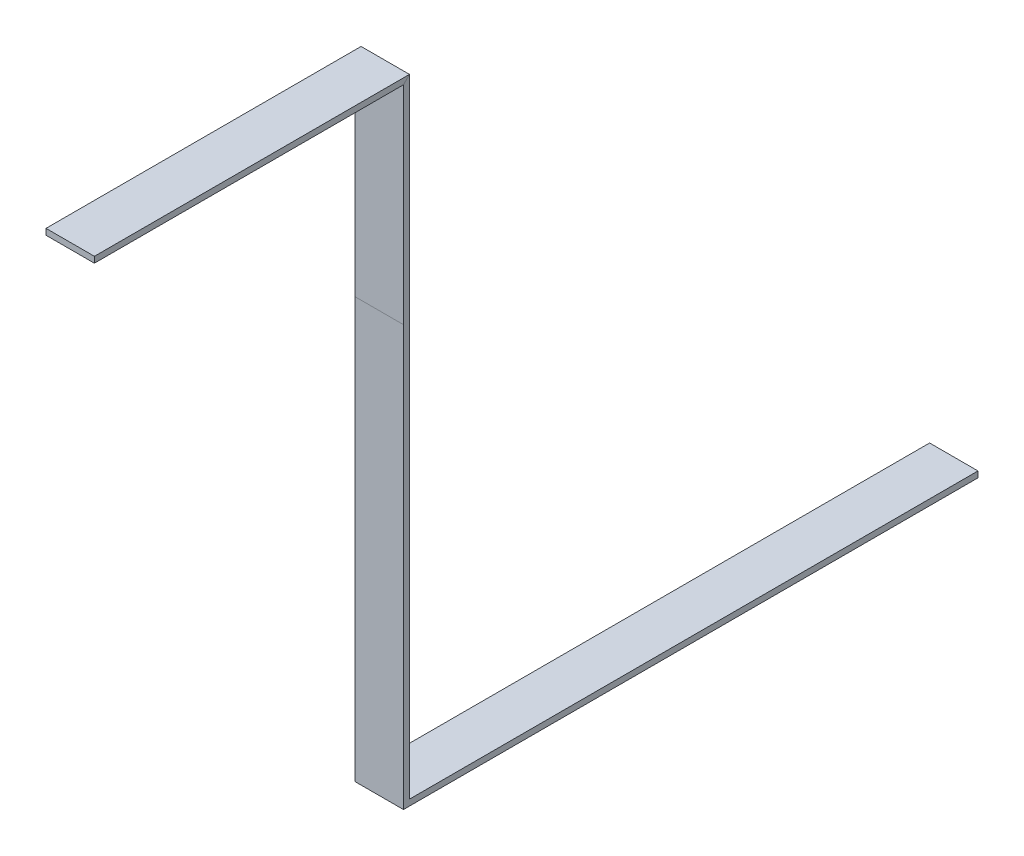
ISO-10303-21;
HEADER;
FILE_DESCRIPTION(('STEP AP214'),'2;1');
FILE_NAME('part.step','',(''),(''),'','','');
FILE_SCHEMA(('AUTOMOTIVE_DESIGN { 1 0 10303 214 1 1 1 1 }'));
ENDSEC;
DATA;
#1=APPLICATION_CONTEXT('core data for automotive mechanical design processes');
#2=APPLICATION_PROTOCOL_DEFINITION('international standard','automotive_design',2000,#1);
#3=PRODUCT_CONTEXT('',#1,'mechanical');
#4=PRODUCT('Part','Part','',(#3));
#5=PRODUCT_RELATED_PRODUCT_CATEGORY('part','',(#4));
#6=PRODUCT_DEFINITION_FORMATION('','',#4);
#7=PRODUCT_DEFINITION_CONTEXT('part definition',#1,'design');
#8=PRODUCT_DEFINITION('design','',#6,#7);
#9=PRODUCT_DEFINITION_SHAPE('','',#8);
#10=(LENGTH_UNIT() NAMED_UNIT(*) SI_UNIT(.MILLI.,.METRE.));
#11=(NAMED_UNIT(*) PLANE_ANGLE_UNIT() SI_UNIT($,.RADIAN.));
#12=(NAMED_UNIT(*) SI_UNIT($,.STERADIAN.) SOLID_ANGLE_UNIT());
#13=UNCERTAINTY_MEASURE_WITH_UNIT(LENGTH_MEASURE(1.E-05),#10,'distance_accuracy_value','');
#14=(GEOMETRIC_REPRESENTATION_CONTEXT(3) GLOBAL_UNCERTAINTY_ASSIGNED_CONTEXT((#13)) GLOBAL_UNIT_ASSIGNED_CONTEXT((#10,
#11,#12)) REPRESENTATION_CONTEXT('',''));
#15=CARTESIAN_POINT('',(0.,0.,0.));
#16=DIRECTION('',(0.,0.,1.));
#17=DIRECTION('',(1.,0.,0.));
#18=AXIS2_PLACEMENT_3D('',#15,#16,#17);
#19=CARTESIAN_POINT('',(-96.5999999999999,-272.07792076474,612.092449283312));
#20=DIRECTION('',(0.,-1.,0.));
#21=DIRECTION('',(0.,0.,-1.));
#22=AXIS2_PLACEMENT_3D('',#19,#20,#21);
#23=PLANE('',#22);
#24=DIRECTION('',(-1.,0.,0.));
#25=VECTOR('',#24,1.);
#26=CARTESIAN_POINT('',(-96.5999999999999,-272.07792076474,0.00397627219106411));
#27=LINE('',#26,#25);
#28=CARTESIAN_POINT('',(25.4,-272.07792076474,0.0039762721910086));
#29=VERTEX_POINT('',#28);
#30=CARTESIAN_POINT('',(-25.4,-272.07792076474,0.00397627219106411));
#31=VERTEX_POINT('',#30);
#32=EDGE_CURVE('E11',#29,#31,#27,.T.);
#33=ORIENTED_EDGE('',*,*,#32,.F.);
#34=DIRECTION('',(0.,0.,-1.));
#35=VECTOR('',#34,1.);
#36=CARTESIAN_POINT('',(25.4,-272.07792076474,612.092449283312));
#37=LINE('',#36,#35);
#38=CARTESIAN_POINT('',(25.4,-272.07792076474,0.));
#39=VERTEX_POINT('',#38);
#40=EDGE_CURVE('E160',#29,#39,#37,.T.);
#41=ORIENTED_EDGE('',*,*,#40,.T.);
#42=DIRECTION('',(1.,0.,0.));
#43=VECTOR('',#42,1.);
#44=CARTESIAN_POINT('',(0.,-272.07792076474,0.));
#45=LINE('',#44,#43);
#46=CARTESIAN_POINT('',(-25.4,-272.07792076474,0.));
#47=VERTEX_POINT('',#46);
#48=EDGE_CURVE('E276',#47,#39,#45,.T.);
#49=ORIENTED_EDGE('',*,*,#48,.F.);
#50=DIRECTION('',(0.,0.,-1.));
#51=VECTOR('',#50,1.);
#52=CARTESIAN_POINT('',(-25.4,-272.07792076474,574.));
#53=LINE('',#52,#51);
#54=EDGE_CURVE('E272',#31,#47,#53,.T.);
#55=ORIENTED_EDGE('',*,*,#54,.F.);
#56=EDGE_LOOP('',(#33,#41,#49,#55));
#57=FACE_BOUND('',#56,.T.);
#58=ADVANCED_FACE('F36',(#57),#23,.F.);
#59=CARTESIAN_POINT('',(25.4,3.155,574.));
#60=DIRECTION('',(-1.,0.,0.));
#61=DIRECTION('',(0.,0.,1.));
#62=AXIS2_PLACEMENT_3D('',#59,#60,#61);
#63=PLANE('',#62);
#64=DIRECTION('',(0.,1.,0.));
#65=VECTOR('',#64,1.);
#66=CARTESIAN_POINT('',(25.4,-278.803420764741,6.3139762721911));
#67=LINE('',#66,#65);
#68=CARTESIAN_POINT('',(25.4,-272.078734833776,6.31088055029496));
#69=VERTEX_POINT('',#68);
#70=CARTESIAN_POINT('',(25.4,-54.0479207647403,6.31397627219113));
#71=VERTEX_POINT('',#70);
#72=EDGE_CURVE('E174',#69,#71,#67,.T.);
#73=ORIENTED_EDGE('',*,*,#72,.F.);
#74=DIRECTION('',(0.,1.,0.));
#75=VECTOR('',#74,1.);
#76=CARTESIAN_POINT('',(25.4,-712.845,6.31000000000004));
#77=LINE('',#76,#75);
#78=CARTESIAN_POINT('',(25.4,-712.845,6.31000000000004));
#79=VERTEX_POINT('',#78);
#80=EDGE_CURVE('E40',#79,#69,#77,.T.);
#81=ORIENTED_EDGE('',*,*,#80,.F.);
#82=DIRECTION('',(0.,0.,-1.));
#83=VECTOR('',#82,1.);
#84=CARTESIAN_POINT('',(25.4,-712.845,0.));
#85=LINE('',#84,#83);
#86=CARTESIAN_POINT('',(25.4,-712.845,-596.7));
#87=VERTEX_POINT('',#86);
#88=EDGE_CURVE('E131',#79,#87,#85,.T.);
#89=ORIENTED_EDGE('',*,*,#88,.T.);
#90=DIRECTION('',(0.,1.,0.));
#91=VECTOR('',#90,1.);
#92=CARTESIAN_POINT('',(25.4,-706.535,-596.7));
#93=LINE('',#92,#91);
#94=CARTESIAN_POINT('',(25.4,-706.535,-596.7));
#95=VERTEX_POINT('',#94);
#96=EDGE_CURVE('E141',#87,#95,#93,.T.);
#97=ORIENTED_EDGE('',*,*,#96,.T.);
#98=DIRECTION('',(0.,0.,1.));
#99=VECTOR('',#98,1.);
#100=CARTESIAN_POINT('',(25.4,-706.535,-596.7));
#101=LINE('',#100,#99);
#102=CARTESIAN_POINT('',(25.4,-706.535,0.));
#103=VERTEX_POINT('',#102);
#104=EDGE_CURVE('E151',#95,#103,#101,.T.);
#105=ORIENTED_EDGE('',*,*,#104,.T.);
#106=DIRECTION('',(0.,1.,0.));
#107=VECTOR('',#106,1.);
#108=CARTESIAN_POINT('',(25.4,3.155,0.));
#109=LINE('',#108,#107);
#110=EDGE_CURVE('E54',#103,#39,#109,.T.);
#111=ORIENTED_EDGE('',*,*,#110,.T.);
#112=ORIENTED_EDGE('',*,*,#40,.F.);
#113=DIRECTION('',(0.,1.,0.));
#114=VECTOR('',#113,1.);
#115=CARTESIAN_POINT('',(25.4,-278.803420764741,0.0039762721910086));
#116=LINE('',#115,#114);
#117=CARTESIAN_POINT('',(25.4,-47.7379207647403,0.00397627219104076));
#118=VERTEX_POINT('',#117);
#119=EDGE_CURVE('E172',#29,#118,#116,.T.);
#120=ORIENTED_EDGE('',*,*,#119,.T.);
#121=DIRECTION('',(0.,0.707106781186548,-0.707106781186548));
#122=VECTOR('',#121,1.);
#123=CARTESIAN_POINT('',(25.4,-163.27067076474,115.536726272191));
#124=LINE('',#123,#122);
#125=EDGE_CURVE('E167',#71,#118,#124,.T.);
#126=ORIENTED_EDGE('',*,*,#125,.F.);
#127=EDGE_LOOP('',(#73,#81,#89,#97,#105,#111,#112,#120,#126));
#128=FACE_BOUND('',#127,.T.);
#129=ADVANCED_FACE('F38',(#128),#63,.F.);
#130=CARTESIAN_POINT('',(-25.4,3.155,574.));
#131=DIRECTION('',(1.,0.,0.));
#132=DIRECTION('',(0.,0.,-1.));
#133=AXIS2_PLACEMENT_3D('',#130,#131,#132);
#134=PLANE('',#133);
#135=DIRECTION('',(0.,-1.,0.));
#136=VECTOR('',#135,1.);
#137=CARTESIAN_POINT('',(-25.4,3.155,0.));
#138=LINE('',#137,#136);
#139=CARTESIAN_POINT('',(-25.4,-706.535,0.));
#140=VERTEX_POINT('',#139);
#141=EDGE_CURVE('E270',#47,#140,#138,.T.);
#142=ORIENTED_EDGE('',*,*,#141,.T.);
#143=DIRECTION('',(0.,0.,1.));
#144=VECTOR('',#143,1.);
#145=CARTESIAN_POINT('',(-25.4,-706.535,-596.7));
#146=LINE('',#145,#144);
#147=CARTESIAN_POINT('',(-25.4,-706.535,-596.7));
#148=VERTEX_POINT('',#147);
#149=EDGE_CURVE('E145',#148,#140,#146,.T.);
#150=ORIENTED_EDGE('',*,*,#149,.F.);
#151=DIRECTION('',(0.,-1.,0.));
#152=VECTOR('',#151,1.);
#153=CARTESIAN_POINT('',(-25.4,-706.535,-596.7));
#154=LINE('',#153,#152);
#155=CARTESIAN_POINT('',(-25.4,-712.845,-596.7));
#156=VERTEX_POINT('',#155);
#157=EDGE_CURVE('E138',#148,#156,#154,.T.);
#158=ORIENTED_EDGE('',*,*,#157,.T.);
#159=DIRECTION('',(0.,0.,1.));
#160=VECTOR('',#159,1.);
#161=CARTESIAN_POINT('',(-25.4,-712.845,0.));
#162=LINE('',#161,#160);
#163=CARTESIAN_POINT('',(-25.4,-712.845,6.31000000000004));
#164=VERTEX_POINT('',#163);
#165=EDGE_CURVE('E122',#156,#164,#162,.T.);
#166=ORIENTED_EDGE('',*,*,#165,.T.);
#167=DIRECTION('',(0.,1.,0.));
#168=VECTOR('',#167,1.);
#169=CARTESIAN_POINT('',(-25.4,-712.845,6.31000000000004));
#170=LINE('',#169,#168);
#171=CARTESIAN_POINT('',(-25.4,-272.078734833776,6.31088055029493));
#172=VERTEX_POINT('',#171);
#173=EDGE_CURVE('E258',#164,#172,#170,.T.);
#174=ORIENTED_EDGE('',*,*,#173,.T.);
#175=DIRECTION('',(0.,1.,0.));
#176=VECTOR('',#175,1.);
#177=CARTESIAN_POINT('',(-25.4,-278.803420764741,6.31397627219099));
#178=LINE('',#177,#176);
#179=CARTESIAN_POINT('',(-25.4,-54.0479207647402,6.31397627219104));
#180=VERTEX_POINT('',#179);
#181=EDGE_CURVE('E170',#172,#180,#178,.T.);
#182=ORIENTED_EDGE('',*,*,#181,.T.);
#183=DIRECTION('',(0.,-0.707106781186548,0.707106781186548));
#184=VECTOR('',#183,1.);
#185=CARTESIAN_POINT('',(-25.4,-163.27067076474,115.536726272191));
#186=LINE('',#185,#184);
#187=CARTESIAN_POINT('',(-25.4,-47.7379207647403,0.00397627219104109));
#188=VERTEX_POINT('',#187);
#189=EDGE_CURVE('E161',#188,#180,#186,.T.);
#190=ORIENTED_EDGE('',*,*,#189,.F.);
#191=DIRECTION('',(0.,1.,0.));
#192=VECTOR('',#191,1.);
#193=CARTESIAN_POINT('',(-25.4,-278.803420764741,0.0039762721910086));
#194=LINE('',#193,#192);
#195=EDGE_CURVE('E168',#31,#188,#194,.T.);
#196=ORIENTED_EDGE('',*,*,#195,.F.);
#197=ORIENTED_EDGE('',*,*,#54,.T.);
#198=EDGE_LOOP('',(#142,#150,#158,#166,#174,#182,#190,#196,#197));
#199=FACE_BOUND('',#198,.T.);
#200=ADVANCED_FACE('F143',(#199),#134,.F.);
#201=CARTESIAN_POINT('',(0.,0.,0.));
#202=DIRECTION('',(0.,0.,1.));
#203=DIRECTION('',(1.,0.,0.));
#204=AXIS2_PLACEMENT_3D('',#201,#202,#203);
#205=PLANE('',#204);
#206=ORIENTED_EDGE('',*,*,#110,.F.);
#207=DIRECTION('',(-1.,0.,0.));
#208=VECTOR('',#207,1.);
#209=CARTESIAN_POINT('',(0.,-706.535,0.));
#210=LINE('',#209,#208);
#211=EDGE_CURVE('E58',#103,#140,#210,.T.);
#212=ORIENTED_EDGE('',*,*,#211,.T.);
#213=ORIENTED_EDGE('',*,*,#141,.F.);
#214=ORIENTED_EDGE('',*,*,#48,.T.);
#215=EDGE_LOOP('',(#206,#212,#213,#214));
#216=FACE_BOUND('',#215,.T.);
#217=ADVANCED_FACE('F252',(#216),#205,.F.);
#218=CARTESIAN_POINT('',(-25.4,-712.845,6.31000000000004));
#219=DIRECTION('',(0.,0.,1.));
#220=DIRECTION('',(1.,0.,0.));
#221=AXIS2_PLACEMENT_3D('',#218,#219,#220);
#222=PLANE('',#221);
#223=CARTESIAN_POINT('',(-25.4,-272.07792076474,6.31397627219099));
#224=DIRECTION('',(1.,0.,0.));
#225=VECTOR('',#224,1.);
#226=LINE('',#223,#225);
#227=EDGE_CURVE('E46',#172,#69,#226,.T.);
#228=ORIENTED_EDGE('',*,*,#227,.F.);
#229=ORIENTED_EDGE('',*,*,#173,.F.);
#230=DIRECTION('',(1.,0.,0.));
#231=VECTOR('',#230,1.);
#232=CARTESIAN_POINT('',(-25.4,-712.845,6.31000000000004));
#233=LINE('',#232,#231);
#234=EDGE_CURVE('E128',#164,#79,#233,.T.);
#235=ORIENTED_EDGE('',*,*,#234,.T.);
#236=ORIENTED_EDGE('',*,*,#80,.T.);
#237=EDGE_LOOP('',(#228,#229,#235,#236));
#238=FACE_BOUND('',#237,.T.);
#239=ADVANCED_FACE('F248',(#238),#222,.T.);
#240=CARTESIAN_POINT('',(0.,-712.845,0.));
#241=DIRECTION('',(0.,1.,0.));
#242=DIRECTION('',(0.,0.,1.));
#243=AXIS2_PLACEMENT_3D('',#240,#241,#242);
#244=PLANE('',#243);
#245=ORIENTED_EDGE('',*,*,#88,.F.);
#246=ORIENTED_EDGE('',*,*,#234,.F.);
#247=ORIENTED_EDGE('',*,*,#165,.F.);
#248=DIRECTION('',(1.,0.,0.));
#249=VECTOR('',#248,1.);
#250=CARTESIAN_POINT('',(25.4,-712.845,-596.7));
#251=LINE('',#250,#249);
#252=EDGE_CURVE('E126',#156,#87,#251,.T.);
#253=ORIENTED_EDGE('',*,*,#252,.T.);
#254=EDGE_LOOP('',(#245,#246,#247,#253));
#255=FACE_BOUND('',#254,.T.);
#256=ADVANCED_FACE('F125',(#255),#244,.F.);
#257=CARTESIAN_POINT('',(-25.4,-278.803420764741,0.0039762721910086));
#258=DIRECTION('',(0.,0.,1.));
#259=DIRECTION('',(1.,0.,0.));
#260=AXIS2_PLACEMENT_3D('',#257,#258,#259);
#261=PLANE('',#260);
#262=ORIENTED_EDGE('',*,*,#119,.F.);
#263=ORIENTED_EDGE('',*,*,#32,.T.);
#264=ORIENTED_EDGE('',*,*,#195,.T.);
#265=DIRECTION('',(-1.,0.,0.));
#266=VECTOR('',#265,1.);
#267=CARTESIAN_POINT('',(-25.4,-47.7379207647402,0.0039762721910086));
#268=LINE('',#267,#266);
#269=EDGE_CURVE('E164',#118,#188,#268,.T.);
#270=ORIENTED_EDGE('',*,*,#269,.F.);
#271=EDGE_LOOP('',(#262,#263,#264,#270));
#272=FACE_BOUND('',#271,.T.);
#273=ADVANCED_FACE('F219',(#272),#261,.F.);
#274=CARTESIAN_POINT('',(0.,-326.125841529481,330.698976272191));
#275=DIRECTION('',(0.,0.,1.));
#276=DIRECTION('',(-1.,0.,0.));
#277=AXIS2_PLACEMENT_3D('',#274,#275,#276);
#278=PLANE('',#277);
#279=DIRECTION('',(0.,-1.,0.));
#280=VECTOR('',#279,1.);
#281=CARTESIAN_POINT('',(25.4,-47.7379207647403,330.698976272191));
#282=LINE('',#281,#280);
#283=CARTESIAN_POINT('',(25.4,-47.7379207647403,330.698976272191));
#284=VERTEX_POINT('',#283);
#285=CARTESIAN_POINT('',(25.4,-54.0479207647404,330.698976272191));
#286=VERTEX_POINT('',#285);
#287=EDGE_CURVE('E182',#284,#286,#282,.T.);
#288=ORIENTED_EDGE('',*,*,#287,.F.);
#289=DIRECTION('',(1.,0.,0.));
#290=VECTOR('',#289,1.);
#291=CARTESIAN_POINT('',(-25.4,-47.7379207647403,330.698976272191));
#292=LINE('',#291,#290);
#293=CARTESIAN_POINT('',(-25.4,-47.7379207647403,330.698976272191));
#294=VERTEX_POINT('',#293);
#295=EDGE_CURVE('E156',#294,#284,#292,.T.);
#296=ORIENTED_EDGE('',*,*,#295,.F.);
#297=DIRECTION('',(0.,1.,0.));
#298=VECTOR('',#297,1.);
#299=CARTESIAN_POINT('',(-25.4,-47.7379207647403,330.698976272191));
#300=LINE('',#299,#298);
#301=CARTESIAN_POINT('',(-25.4,-54.0479207647402,330.698976272191));
#302=VERTEX_POINT('',#301);
#303=EDGE_CURVE('E178',#302,#294,#300,.T.);
#304=ORIENTED_EDGE('',*,*,#303,.F.);
#305=DIRECTION('',(-1.,0.,0.));
#306=VECTOR('',#305,1.);
#307=CARTESIAN_POINT('',(-25.4,-54.0479207647402,330.698976272191));
#308=LINE('',#307,#306);
#309=EDGE_CURVE('E180',#286,#302,#308,.T.);
#310=ORIENTED_EDGE('',*,*,#309,.F.);
#311=EDGE_LOOP('',(#288,#296,#304,#310));
#312=FACE_BOUND('',#311,.T.);
#313=ADVANCED_FACE('F223',(#312),#278,.T.);
#314=CARTESIAN_POINT('',(25.4,-47.7379207647403,-0.411523727808952));
#315=DIRECTION('',(-1.,0.,0.));
#316=DIRECTION('',(0.,-1.,0.));
#317=AXIS2_PLACEMENT_3D('',#314,#315,#316);
#318=PLANE('',#317);
#319=ORIENTED_EDGE('',*,*,#125,.T.);
#320=DIRECTION('',(0.,0.,1.));
#321=VECTOR('',#320,1.);
#322=CARTESIAN_POINT('',(25.4,-47.7379207647403,-0.411523727808952));
#323=LINE('',#322,#321);
#324=EDGE_CURVE('E171',#118,#284,#323,.T.);
#325=ORIENTED_EDGE('',*,*,#324,.T.);
#326=ORIENTED_EDGE('',*,*,#287,.T.);
#327=DIRECTION('',(0.,0.,1.));
#328=VECTOR('',#327,1.);
#329=CARTESIAN_POINT('',(25.4,-54.0479207647404,-0.411523727808951));
#330=LINE('',#329,#328);
#331=EDGE_CURVE('E190',#71,#286,#330,.T.);
#332=ORIENTED_EDGE('',*,*,#331,.F.);
#333=EDGE_LOOP('',(#319,#325,#326,#332));
#334=FACE_BOUND('',#333,.T.);
#335=ADVANCED_FACE('F225',(#334),#318,.F.);
#336=CARTESIAN_POINT('',(-25.4,-54.0479207647402,-0.411523727808951));
#337=DIRECTION('',(0.,1.,0.));
#338=DIRECTION('',(-1.,0.,0.));
#339=AXIS2_PLACEMENT_3D('',#336,#337,#338);
#340=PLANE('',#339);
#341=DIRECTION('',(1.,0.,0.));
#342=VECTOR('',#341,1.);
#343=CARTESIAN_POINT('',(-25.3999999999995,-54.0479207647402,6.31397627219099));
#344=LINE('',#343,#342);
#345=EDGE_CURVE('E157',#180,#71,#344,.T.);
#346=ORIENTED_EDGE('',*,*,#345,.T.);
#347=ORIENTED_EDGE('',*,*,#331,.T.);
#348=ORIENTED_EDGE('',*,*,#309,.T.);
#349=DIRECTION('',(0.,0.,1.));
#350=VECTOR('',#349,1.);
#351=CARTESIAN_POINT('',(-25.4,-54.0479207647402,-0.411523727808951));
#352=LINE('',#351,#350);
#353=EDGE_CURVE('E187',#180,#302,#352,.T.);
#354=ORIENTED_EDGE('',*,*,#353,.F.);
#355=EDGE_LOOP('',(#346,#347,#348,#354));
#356=FACE_BOUND('',#355,.T.);
#357=ADVANCED_FACE('F228',(#356),#340,.F.);
#358=CARTESIAN_POINT('',(-25.4,-47.7379207647403,-0.411523727808952));
#359=DIRECTION('',(1.,0.,0.));
#360=DIRECTION('',(0.,1.,0.));
#361=AXIS2_PLACEMENT_3D('',#358,#359,#360);
#362=PLANE('',#361);
#363=ORIENTED_EDGE('',*,*,#189,.T.);
#364=ORIENTED_EDGE('',*,*,#353,.T.);
#365=ORIENTED_EDGE('',*,*,#303,.T.);
#366=DIRECTION('',(0.,0.,1.));
#367=VECTOR('',#366,1.);
#368=CARTESIAN_POINT('',(-25.4,-47.7379207647403,-0.411523727808952));
#369=LINE('',#368,#367);
#370=EDGE_CURVE('E184',#188,#294,#369,.T.);
#371=ORIENTED_EDGE('',*,*,#370,.F.);
#372=EDGE_LOOP('',(#363,#364,#365,#371));
#373=FACE_BOUND('',#372,.T.);
#374=ADVANCED_FACE('F232',(#373),#362,.F.);
#375=CARTESIAN_POINT('',(-25.4,-47.7379207647403,-0.411523727808952));
#376=DIRECTION('',(0.,-1.,0.));
#377=DIRECTION('',(1.,0.,0.));
#378=AXIS2_PLACEMENT_3D('',#375,#376,#377);
#379=PLANE('',#378);
#380=ORIENTED_EDGE('',*,*,#269,.T.);
#381=ORIENTED_EDGE('',*,*,#370,.T.);
#382=ORIENTED_EDGE('',*,*,#295,.T.);
#383=ORIENTED_EDGE('',*,*,#324,.F.);
#384=EDGE_LOOP('',(#380,#381,#382,#383));
#385=FACE_BOUND('',#384,.T.);
#386=ADVANCED_FACE('F218',(#385),#379,.F.);
#387=CARTESIAN_POINT('',(-25.4,-278.803420764741,6.31397627219099));
#388=DIRECTION('',(0.,0.,-1.));
#389=DIRECTION('',(-1.,0.,0.));
#390=AXIS2_PLACEMENT_3D('',#387,#388,#389);
#391=PLANE('',#390);
#392=ORIENTED_EDGE('',*,*,#181,.F.);
#393=ORIENTED_EDGE('',*,*,#227,.T.);
#394=ORIENTED_EDGE('',*,*,#72,.T.);
#395=ORIENTED_EDGE('',*,*,#345,.F.);
#396=EDGE_LOOP('',(#392,#393,#394,#395));
#397=FACE_BOUND('',#396,.T.);
#398=ADVANCED_FACE('F207',(#397),#391,.F.);
#399=CARTESIAN_POINT('',(25.4,-706.535,-596.7));
#400=DIRECTION('',(0.,1.,0.));
#401=DIRECTION('',(0.,0.,1.));
#402=AXIS2_PLACEMENT_3D('',#399,#400,#401);
#403=PLANE('',#402);
#404=ORIENTED_EDGE('',*,*,#211,.F.);
#405=ORIENTED_EDGE('',*,*,#104,.F.);
#406=DIRECTION('',(-1.,0.,0.));
#407=VECTOR('',#406,1.);
#408=CARTESIAN_POINT('',(25.4,-706.535,-596.7));
#409=LINE('',#408,#407);
#410=EDGE_CURVE('E149',#95,#148,#409,.T.);
#411=ORIENTED_EDGE('',*,*,#410,.T.);
#412=ORIENTED_EDGE('',*,*,#149,.T.);
#413=EDGE_LOOP('',(#404,#405,#411,#412));
#414=FACE_BOUND('',#413,.T.);
#415=ADVANCED_FACE('F217',(#414),#403,.T.);
#416=CARTESIAN_POINT('',(0.,0.,-596.7));
#417=DIRECTION('',(0.,0.,-1.));
#418=DIRECTION('',(-1.,0.,0.));
#419=AXIS2_PLACEMENT_3D('',#416,#417,#418);
#420=PLANE('',#419);
#421=ORIENTED_EDGE('',*,*,#157,.F.);
#422=ORIENTED_EDGE('',*,*,#410,.F.);
#423=ORIENTED_EDGE('',*,*,#96,.F.);
#424=ORIENTED_EDGE('',*,*,#252,.F.);
#425=EDGE_LOOP('',(#421,#422,#423,#424));
#426=FACE_BOUND('',#425,.T.);
#427=ADVANCED_FACE('F136',(#426),#420,.T.);
#428=CLOSED_SHELL('',(#58,#129,#200,#217,#239,#256,#273,#313,#335,#357,#374,#386,#398,#415,#427));
#429=MANIFOLD_SOLID_BREP('B2',#428);
#430=ADVANCED_BREP_SHAPE_REPRESENTATION('',(#18,#429),#14);
#431=SHAPE_DEFINITION_REPRESENTATION(#9,#430);
ENDSEC;
END-ISO-10303-21;
